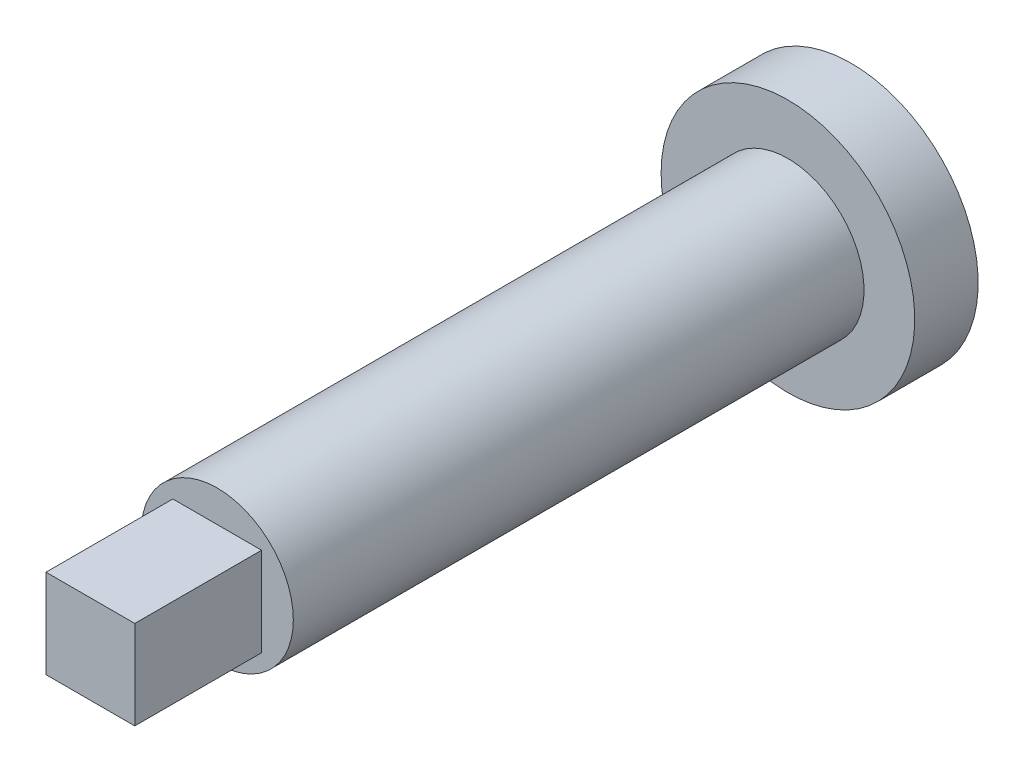
ISO-10303-21;
HEADER;
FILE_DESCRIPTION(('STEP AP214'),'2;1');
FILE_NAME('part.step','',(''),(''),'','','');
FILE_SCHEMA(('AUTOMOTIVE_DESIGN { 1 0 10303 214 1 1 1 1 }'));
ENDSEC;
DATA;
#1=APPLICATION_CONTEXT('core data for automotive mechanical design processes');
#2=APPLICATION_PROTOCOL_DEFINITION('international standard','automotive_design',2000,#1);
#3=PRODUCT_CONTEXT('',#1,'mechanical');
#4=PRODUCT('Part','Part','',(#3));
#5=PRODUCT_RELATED_PRODUCT_CATEGORY('part','',(#4));
#6=PRODUCT_DEFINITION_FORMATION('','',#4);
#7=PRODUCT_DEFINITION_CONTEXT('part definition',#1,'design');
#8=PRODUCT_DEFINITION('design','',#6,#7);
#9=PRODUCT_DEFINITION_SHAPE('','',#8);
#10=(LENGTH_UNIT() NAMED_UNIT(*) SI_UNIT(.MILLI.,.METRE.));
#11=(NAMED_UNIT(*) PLANE_ANGLE_UNIT() SI_UNIT($,.RADIAN.));
#12=(NAMED_UNIT(*) SI_UNIT($,.STERADIAN.) SOLID_ANGLE_UNIT());
#13=UNCERTAINTY_MEASURE_WITH_UNIT(LENGTH_MEASURE(1.E-05),#10,'distance_accuracy_value','');
#14=(GEOMETRIC_REPRESENTATION_CONTEXT(3) GLOBAL_UNCERTAINTY_ASSIGNED_CONTEXT((#13)) GLOBAL_UNIT_ASSIGNED_CONTEXT((#10,
#11,#12)) REPRESENTATION_CONTEXT('',''));
#15=CARTESIAN_POINT('',(0.,0.,0.));
#16=DIRECTION('',(0.,0.,1.));
#17=DIRECTION('',(1.,0.,0.));
#18=AXIS2_PLACEMENT_3D('',#15,#16,#17);
#19=CARTESIAN_POINT('',(0.,0.,50.));
#20=DIRECTION('',(0.,0.,1.));
#21=DIRECTION('',(1.,0.,0.));
#22=AXIS2_PLACEMENT_3D('',#19,#20,#21);
#23=PLANE('',#22);
#24=CARTESIAN_POINT('',(0.,0.,50.));
#25=DIRECTION('',(0.,0.,1.));
#26=DIRECTION('',(1.,0.,0.));
#27=AXIS2_PLACEMENT_3D('',#24,#25,#26);
#28=CIRCLE('',#27,6.);
#29=CARTESIAN_POINT('',(6.,0.,50.));
#30=VERTEX_POINT('',#29);
#31=EDGE_CURVE('E53',#30,#30,#28,.T.);
#32=ORIENTED_EDGE('',*,*,#31,.T.);
#33=EDGE_LOOP('',(#32));
#34=FACE_BOUND('',#33,.T.);
#35=DIRECTION('',(-1.,0.,0.));
#36=VECTOR('',#35,1.);
#37=CARTESIAN_POINT('',(-3.5,3.5,50.));
#38=LINE('',#37,#36);
#39=CARTESIAN_POINT('',(3.5,3.5,50.));
#40=VERTEX_POINT('',#39);
#41=CARTESIAN_POINT('',(-3.5,3.5,50.));
#42=VERTEX_POINT('',#41);
#43=EDGE_CURVE('E101',#40,#42,#38,.T.);
#44=ORIENTED_EDGE('',*,*,#43,.F.);
#45=DIRECTION('',(0.,1.,0.));
#46=VECTOR('',#45,1.);
#47=CARTESIAN_POINT('',(3.5,-3.5,50.));
#48=LINE('',#47,#46);
#49=CARTESIAN_POINT('',(3.5,-3.5,50.));
#50=VERTEX_POINT('',#49);
#51=EDGE_CURVE('E112',#50,#40,#48,.T.);
#52=ORIENTED_EDGE('',*,*,#51,.F.);
#53=DIRECTION('',(1.,0.,0.));
#54=VECTOR('',#53,1.);
#55=CARTESIAN_POINT('',(-3.5,-3.5,50.));
#56=LINE('',#55,#54);
#57=CARTESIAN_POINT('',(-3.5,-3.5,50.));
#58=VERTEX_POINT('',#57);
#59=EDGE_CURVE('E82',#58,#50,#56,.T.);
#60=ORIENTED_EDGE('',*,*,#59,.F.);
#61=DIRECTION('',(0.,-1.,0.));
#62=VECTOR('',#61,1.);
#63=CARTESIAN_POINT('',(-3.5,-3.5,50.));
#64=LINE('',#63,#62);
#65=EDGE_CURVE('E116',#42,#58,#64,.T.);
#66=ORIENTED_EDGE('',*,*,#65,.F.);
#67=EDGE_LOOP('',(#44,#52,#60,#66));
#68=FACE_BOUND('',#67,.T.);
#69=ADVANCED_FACE('F45',(#34,#68),#23,.T.);
#70=CARTESIAN_POINT('',(0.,0.,50.));
#71=DIRECTION('',(0.,0.,-1.));
#72=DIRECTION('',(-1.,0.,0.));
#73=AXIS2_PLACEMENT_3D('',#70,#71,#72);
#74=CYLINDRICAL_SURFACE('',#73,6.);
#75=ORIENTED_EDGE('',*,*,#31,.F.);
#76=EDGE_LOOP('',(#75));
#77=FACE_BOUND('',#76,.T.);
#78=CARTESIAN_POINT('',(0.,0.,5.));
#79=DIRECTION('',(0.,0.,-1.));
#80=DIRECTION('',(-1.,0.,0.));
#81=AXIS2_PLACEMENT_3D('',#78,#79,#80);
#82=CIRCLE('',#81,6.);
#83=CARTESIAN_POINT('',(-6.,0.,5.));
#84=VERTEX_POINT('',#83);
#85=EDGE_CURVE('E13',#84,#84,#82,.T.);
#86=ORIENTED_EDGE('',*,*,#85,.F.);
#87=EDGE_LOOP('',(#86));
#88=FACE_BOUND('',#87,.T.);
#89=ADVANCED_FACE('F47',(#77,#88),#74,.T.);
#90=CARTESIAN_POINT('',(0.,0.,5.));
#91=DIRECTION('',(0.,0.,-1.));
#92=DIRECTION('',(-1.,0.,0.));
#93=AXIS2_PLACEMENT_3D('',#90,#91,#92);
#94=CYLINDRICAL_SURFACE('',#93,10.);
#95=CARTESIAN_POINT('',(0.,0.,5.));
#96=DIRECTION('',(0.,0.,-1.));
#97=DIRECTION('',(-1.,0.,0.));
#98=AXIS2_PLACEMENT_3D('',#95,#96,#97);
#99=CIRCLE('',#98,10.);
#100=CARTESIAN_POINT('',(-10.,0.,5.));
#101=VERTEX_POINT('',#100);
#102=EDGE_CURVE('E123',#101,#101,#99,.T.);
#103=ORIENTED_EDGE('',*,*,#102,.T.);
#104=EDGE_LOOP('',(#103));
#105=FACE_BOUND('',#104,.T.);
#106=CARTESIAN_POINT('',(0.,0.,0.));
#107=DIRECTION('',(0.,0.,-1.));
#108=DIRECTION('',(-1.,0.,0.));
#109=AXIS2_PLACEMENT_3D('',#106,#107,#108);
#110=CIRCLE('',#109,10.);
#111=CARTESIAN_POINT('',(-10.,0.,0.));
#112=VERTEX_POINT('',#111);
#113=EDGE_CURVE('E122',#112,#112,#110,.T.);
#114=ORIENTED_EDGE('',*,*,#113,.F.);
#115=EDGE_LOOP('',(#114));
#116=FACE_BOUND('',#115,.T.);
#117=ADVANCED_FACE('F134',(#105,#116),#94,.T.);
#118=CARTESIAN_POINT('',(0.,0.,5.));
#119=DIRECTION('',(0.,0.,-1.));
#120=DIRECTION('',(-1.,0.,0.));
#121=AXIS2_PLACEMENT_3D('',#118,#119,#120);
#122=PLANE('',#121);
#123=ORIENTED_EDGE('',*,*,#85,.T.);
#124=EDGE_LOOP('',(#123));
#125=FACE_BOUND('',#124,.T.);
#126=ORIENTED_EDGE('',*,*,#102,.F.);
#127=EDGE_LOOP('',(#126));
#128=FACE_BOUND('',#127,.T.);
#129=ADVANCED_FACE('F137',(#125,#128),#122,.F.);
#130=CARTESIAN_POINT('',(0.,0.,0.));
#131=DIRECTION('',(0.,0.,1.));
#132=DIRECTION('',(1.,0.,0.));
#133=AXIS2_PLACEMENT_3D('',#130,#131,#132);
#134=PLANE('',#133);
#135=ORIENTED_EDGE('',*,*,#113,.T.);
#136=EDGE_LOOP('',(#135));
#137=FACE_BOUND('',#136,.T.);
#138=ADVANCED_FACE('F140',(#137),#134,.F.);
#139=CARTESIAN_POINT('',(3.5,-3.5,60.));
#140=DIRECTION('',(-1.,0.,0.));
#141=DIRECTION('',(0.,0.,1.));
#142=AXIS2_PLACEMENT_3D('',#139,#140,#141);
#143=PLANE('',#142);
#144=ORIENTED_EDGE('',*,*,#51,.T.);
#145=DIRECTION('',(0.,0.,-1.));
#146=VECTOR('',#145,1.);
#147=CARTESIAN_POINT('',(3.5,3.5,60.));
#148=LINE('',#147,#146);
#149=CARTESIAN_POINT('',(3.5,3.5,60.));
#150=VERTEX_POINT('',#149);
#151=EDGE_CURVE('E104',#150,#40,#148,.T.);
#152=ORIENTED_EDGE('',*,*,#151,.F.);
#153=DIRECTION('',(0.,1.,0.));
#154=VECTOR('',#153,1.);
#155=CARTESIAN_POINT('',(3.5,-3.5,60.));
#156=LINE('',#155,#154);
#157=CARTESIAN_POINT('',(3.5,-3.5,60.));
#158=VERTEX_POINT('',#157);
#159=EDGE_CURVE('E94',#158,#150,#156,.T.);
#160=ORIENTED_EDGE('',*,*,#159,.F.);
#161=DIRECTION('',(0.,0.,-1.));
#162=VECTOR('',#161,1.);
#163=CARTESIAN_POINT('',(3.5,-3.5,60.));
#164=LINE('',#163,#162);
#165=EDGE_CURVE('E108',#158,#50,#164,.T.);
#166=ORIENTED_EDGE('',*,*,#165,.T.);
#167=EDGE_LOOP('',(#144,#152,#160,#166));
#168=FACE_BOUND('',#167,.T.);
#169=ADVANCED_FACE('F150',(#168),#143,.F.);
#170=CARTESIAN_POINT('',(-3.5,3.5,60.));
#171=DIRECTION('',(0.,-1.,0.));
#172=DIRECTION('',(0.,0.,-1.));
#173=AXIS2_PLACEMENT_3D('',#170,#171,#172);
#174=PLANE('',#173);
#175=ORIENTED_EDGE('',*,*,#43,.T.);
#176=DIRECTION('',(0.,0.,-1.));
#177=VECTOR('',#176,1.);
#178=CARTESIAN_POINT('',(-3.5,3.5,60.));
#179=LINE('',#178,#177);
#180=CARTESIAN_POINT('',(-3.5,3.5,60.));
#181=VERTEX_POINT('',#180);
#182=EDGE_CURVE('E98',#181,#42,#179,.T.);
#183=ORIENTED_EDGE('',*,*,#182,.F.);
#184=DIRECTION('',(-1.,0.,0.));
#185=VECTOR('',#184,1.);
#186=CARTESIAN_POINT('',(-3.5,3.5,60.));
#187=LINE('',#186,#185);
#188=EDGE_CURVE('E89',#150,#181,#187,.T.);
#189=ORIENTED_EDGE('',*,*,#188,.F.);
#190=ORIENTED_EDGE('',*,*,#151,.T.);
#191=EDGE_LOOP('',(#175,#183,#189,#190));
#192=FACE_BOUND('',#191,.T.);
#193=ADVANCED_FACE('F99',(#192),#174,.F.);
#194=CARTESIAN_POINT('',(-3.5,-3.5,60.));
#195=DIRECTION('',(1.,0.,0.));
#196=DIRECTION('',(0.,0.,-1.));
#197=AXIS2_PLACEMENT_3D('',#194,#195,#196);
#198=PLANE('',#197);
#199=ORIENTED_EDGE('',*,*,#65,.T.);
#200=DIRECTION('',(0.,0.,-1.));
#201=VECTOR('',#200,1.);
#202=CARTESIAN_POINT('',(-3.5,-3.5,60.));
#203=LINE('',#202,#201);
#204=CARTESIAN_POINT('',(-3.5,-3.5,60.));
#205=VERTEX_POINT('',#204);
#206=EDGE_CURVE('E60',#205,#58,#203,.T.);
#207=ORIENTED_EDGE('',*,*,#206,.F.);
#208=DIRECTION('',(0.,-1.,0.));
#209=VECTOR('',#208,1.);
#210=CARTESIAN_POINT('',(-3.5,-3.5,60.));
#211=LINE('',#210,#209);
#212=EDGE_CURVE('E92',#181,#205,#211,.T.);
#213=ORIENTED_EDGE('',*,*,#212,.F.);
#214=ORIENTED_EDGE('',*,*,#182,.T.);
#215=EDGE_LOOP('',(#199,#207,#213,#214));
#216=FACE_BOUND('',#215,.T.);
#217=ADVANCED_FACE('F106',(#216),#198,.F.);
#218=CARTESIAN_POINT('',(-3.5,-3.5,60.));
#219=DIRECTION('',(0.,1.,0.));
#220=DIRECTION('',(0.,0.,1.));
#221=AXIS2_PLACEMENT_3D('',#218,#219,#220);
#222=PLANE('',#221);
#223=ORIENTED_EDGE('',*,*,#59,.T.);
#224=ORIENTED_EDGE('',*,*,#165,.F.);
#225=DIRECTION('',(1.,0.,0.));
#226=VECTOR('',#225,1.);
#227=CARTESIAN_POINT('',(-3.5,-3.5,60.));
#228=LINE('',#227,#226);
#229=EDGE_CURVE('E68',#205,#158,#228,.T.);
#230=ORIENTED_EDGE('',*,*,#229,.F.);
#231=ORIENTED_EDGE('',*,*,#206,.T.);
#232=EDGE_LOOP('',(#223,#224,#230,#231));
#233=FACE_BOUND('',#232,.T.);
#234=ADVANCED_FACE('F165',(#233),#222,.F.);
#235=CARTESIAN_POINT('',(0.,0.,60.));
#236=DIRECTION('',(0.,0.,-1.));
#237=DIRECTION('',(-1.,0.,0.));
#238=AXIS2_PLACEMENT_3D('',#235,#236,#237);
#239=PLANE('',#238);
#240=ORIENTED_EDGE('',*,*,#159,.T.);
#241=ORIENTED_EDGE('',*,*,#188,.T.);
#242=ORIENTED_EDGE('',*,*,#212,.T.);
#243=ORIENTED_EDGE('',*,*,#229,.T.);
#244=EDGE_LOOP('',(#240,#241,#242,#243));
#245=FACE_BOUND('',#244,.T.);
#246=ADVANCED_FACE('F90',(#245),#239,.F.);
#247=CLOSED_SHELL('',(#69,#89,#117,#129,#138,#169,#193,#217,#234,#246));
#248=MANIFOLD_SOLID_BREP('B2',#247);
#249=ADVANCED_BREP_SHAPE_REPRESENTATION('',(#18,#248),#14);
#250=SHAPE_DEFINITION_REPRESENTATION(#9,#249);
ENDSEC;
END-ISO-10303-21;
